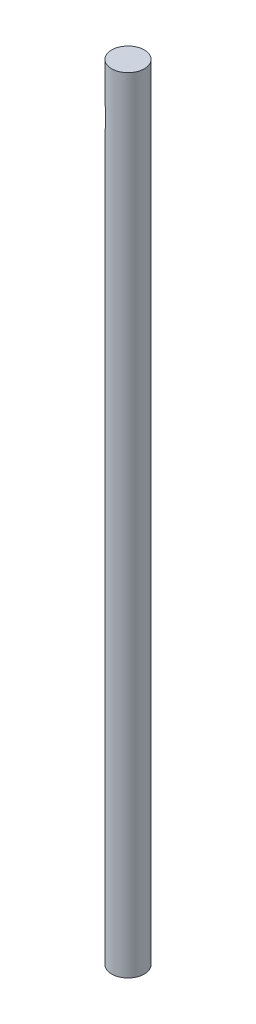
ISO-10303-21;
HEADER;
FILE_DESCRIPTION(('STEP AP214'),'2;1');
FILE_NAME('part.step','',(''),(''),'','','');
FILE_SCHEMA(('AUTOMOTIVE_DESIGN { 1 0 10303 214 1 1 1 1 }'));
ENDSEC;
DATA;
#1=APPLICATION_CONTEXT('core data for automotive mechanical design processes');
#2=APPLICATION_PROTOCOL_DEFINITION('international standard','automotive_design',2000,#1);
#3=PRODUCT_CONTEXT('',#1,'mechanical');
#4=PRODUCT('Part','Part','',(#3));
#5=PRODUCT_RELATED_PRODUCT_CATEGORY('part','',(#4));
#6=PRODUCT_DEFINITION_FORMATION('','',#4);
#7=PRODUCT_DEFINITION_CONTEXT('part definition',#1,'design');
#8=PRODUCT_DEFINITION('design','',#6,#7);
#9=PRODUCT_DEFINITION_SHAPE('','',#8);
#10=(LENGTH_UNIT() NAMED_UNIT(*) SI_UNIT(.MILLI.,.METRE.));
#11=(NAMED_UNIT(*) PLANE_ANGLE_UNIT() SI_UNIT($,.RADIAN.));
#12=(NAMED_UNIT(*) SI_UNIT($,.STERADIAN.) SOLID_ANGLE_UNIT());
#13=UNCERTAINTY_MEASURE_WITH_UNIT(LENGTH_MEASURE(1.E-05),#10,'distance_accuracy_value','');
#14=(GEOMETRIC_REPRESENTATION_CONTEXT(3) GLOBAL_UNCERTAINTY_ASSIGNED_CONTEXT((#13)) GLOBAL_UNIT_ASSIGNED_CONTEXT((#10,
#11,#12)) REPRESENTATION_CONTEXT('',''));
#15=CARTESIAN_POINT('',(0.,0.,0.));
#16=DIRECTION('',(0.,0.,1.));
#17=DIRECTION('',(1.,0.,0.));
#18=AXIS2_PLACEMENT_3D('',#15,#16,#17);
#19=CARTESIAN_POINT('',(0.,609.6,0.));
#20=DIRECTION('',(0.,-1.,0.));
#21=DIRECTION('',(0.,0.,-1.));
#22=AXIS2_PLACEMENT_3D('',#19,#20,#21);
#23=CYLINDRICAL_SURFACE('',#22,12.7);
#24=DIRECTION('',(0.,-1.,0.));
#25=VECTOR('',#24,1.);
#26=CARTESIAN_POINT('',(-6.35,609.6,-10.9985226280624));
#27=LINE('',#26,#25);
#28=CARTESIAN_POINT('',(-6.35,578.104,-10.9985226280624));
#29=VERTEX_POINT('',#28);
#30=CARTESIAN_POINT('',(-6.35,565.404,-10.9985226280624));
#31=VERTEX_POINT('',#30);
#32=EDGE_CURVE('E11',#29,#31,#27,.T.);
#33=ORIENTED_EDGE('',*,*,#32,.F.);
#34=CARTESIAN_POINT('',(0.,571.754,0.));
#35=DIRECTION('',(-0.707106781186548,-0.707106781186547,0.));
#36=DIRECTION('',(0.707106781186548,-0.707106781186547,0.));
#37=AXIS2_PLACEMENT_3D('',#34,#35,#36);
#38=ELLIPSE('',#37,17.9605122421383,12.7);
#39=CARTESIAN_POINT('',(-6.35,578.104,10.9985226280624));
#40=VERTEX_POINT('',#39);
#41=EDGE_CURVE('E65',#29,#40,#38,.F.);
#42=ORIENTED_EDGE('',*,*,#41,.T.);
#43=DIRECTION('',(0.,-1.,0.));
#44=VECTOR('',#43,1.);
#45=CARTESIAN_POINT('',(-6.35,609.6,10.9985226280624));
#46=LINE('',#45,#44);
#47=CARTESIAN_POINT('',(-6.35,565.404,10.9985226280624));
#48=VERTEX_POINT('',#47);
#49=EDGE_CURVE('E41',#48,#40,#46,.F.);
#50=ORIENTED_EDGE('',*,*,#49,.F.);
#51=CARTESIAN_POINT('',(0.,571.754,0.));
#52=DIRECTION('',(0.707106781186548,-0.707106781186547,0.));
#53=DIRECTION('',(-0.707106781186548,-0.707106781186547,0.));
#54=AXIS2_PLACEMENT_3D('',#51,#52,#53);
#55=ELLIPSE('',#54,17.9605122421383,12.7);
#56=EDGE_CURVE('E47',#48,#31,#55,.T.);
#57=ORIENTED_EDGE('',*,*,#56,.T.);
#58=EDGE_LOOP('',(#33,#42,#50,#57));
#59=FACE_BOUND('',#58,.T.);
#60=CARTESIAN_POINT('',(0.,609.6,0.));
#61=DIRECTION('',(0.,1.,0.));
#62=DIRECTION('',(0.,0.,1.));
#63=AXIS2_PLACEMENT_3D('',#60,#61,#62);
#64=CIRCLE('',#63,12.7);
#65=CARTESIAN_POINT('',(0.,609.6,12.7));
#66=VERTEX_POINT('',#65);
#67=EDGE_CURVE('E72',#66,#66,#64,.T.);
#68=ORIENTED_EDGE('',*,*,#67,.F.);
#69=EDGE_LOOP('',(#68));
#70=FACE_BOUND('',#69,.T.);
#71=CARTESIAN_POINT('',(0.,0.,0.));
#72=DIRECTION('',(0.,1.,0.));
#73=DIRECTION('',(0.,0.,1.));
#74=AXIS2_PLACEMENT_3D('',#71,#72,#73);
#75=CIRCLE('',#74,12.7);
#76=CARTESIAN_POINT('',(0.,0.,12.7));
#77=VERTEX_POINT('',#76);
#78=EDGE_CURVE('E68',#77,#77,#75,.T.);
#79=ORIENTED_EDGE('',*,*,#78,.T.);
#80=EDGE_LOOP('',(#79));
#81=FACE_BOUND('',#80,.T.);
#82=ADVANCED_FACE('F34',(#59,#70,#81),#23,.T.);
#83=CARTESIAN_POINT('',(0.,609.6,0.));
#84=DIRECTION('',(0.,1.,0.));
#85=DIRECTION('',(0.,0.,1.));
#86=AXIS2_PLACEMENT_3D('',#83,#84,#85);
#87=PLANE('',#86);
#88=ORIENTED_EDGE('',*,*,#67,.T.);
#89=EDGE_LOOP('',(#88));
#90=FACE_BOUND('',#89,.T.);
#91=ADVANCED_FACE('F80',(#90),#87,.T.);
#92=CARTESIAN_POINT('',(0.,0.,0.));
#93=DIRECTION('',(0.,1.,0.));
#94=DIRECTION('',(0.,0.,1.));
#95=AXIS2_PLACEMENT_3D('',#92,#93,#94);
#96=PLANE('',#95);
#97=ORIENTED_EDGE('',*,*,#78,.F.);
#98=EDGE_LOOP('',(#97));
#99=FACE_BOUND('',#98,.T.);
#100=ADVANCED_FACE('F85',(#99),#96,.F.);
#101=CARTESIAN_POINT('',(-6.35,571.754,0.));
#102=DIRECTION('',(-1.,0.,0.));
#103=DIRECTION('',(0.,0.,1.));
#104=AXIS2_PLACEMENT_3D('',#101,#102,#103);
#105=CYLINDRICAL_SURFACE('',#104,12.7);
#106=CARTESIAN_POINT('',(-6.35,571.754,0.));
#107=DIRECTION('',(-1.,0.,0.));
#108=DIRECTION('',(0.,0.,1.));
#109=AXIS2_PLACEMENT_3D('',#106,#107,#108);
#110=CIRCLE('',#109,12.7);
#111=EDGE_CURVE('E61',#40,#29,#110,.T.);
#112=ORIENTED_EDGE('',*,*,#111,.F.);
#113=ORIENTED_EDGE('',*,*,#41,.F.);
#114=EDGE_LOOP('',(#112,#113));
#115=FACE_BOUND('',#114,.T.);
#116=ADVANCED_FACE('F67',(#115),#105,.F.);
#117=EDGE_CURVE('E62',#31,#48,#110,.T.);
#118=ORIENTED_EDGE('',*,*,#117,.F.);
#119=ORIENTED_EDGE('',*,*,#56,.F.);
#120=EDGE_LOOP('',(#118,#119));
#121=FACE_BOUND('',#120,.T.);
#122=ADVANCED_FACE('F91',(#121),#105,.F.);
#123=CARTESIAN_POINT('',(-6.35,571.754,0.));
#124=DIRECTION('',(-1.,0.,0.));
#125=DIRECTION('',(0.,0.,1.));
#126=AXIS2_PLACEMENT_3D('',#123,#124,#125);
#127=PLANE('',#126);
#128=ORIENTED_EDGE('',*,*,#32,.T.);
#129=ORIENTED_EDGE('',*,*,#117,.T.);
#130=ORIENTED_EDGE('',*,*,#49,.T.);
#131=ORIENTED_EDGE('',*,*,#111,.T.);
#132=EDGE_LOOP('',(#128,#129,#130,#131));
#133=FACE_BOUND('',#132,.T.);
#134=ADVANCED_FACE('F60',(#133),#127,.T.);
#135=CLOSED_SHELL('',(#82,#91,#100,#116,#122,#134));
#136=MANIFOLD_SOLID_BREP('B2',#135);
#137=ADVANCED_BREP_SHAPE_REPRESENTATION('',(#18,#136),#14);
#138=SHAPE_DEFINITION_REPRESENTATION(#9,#137);
ENDSEC;
END-ISO-10303-21;
